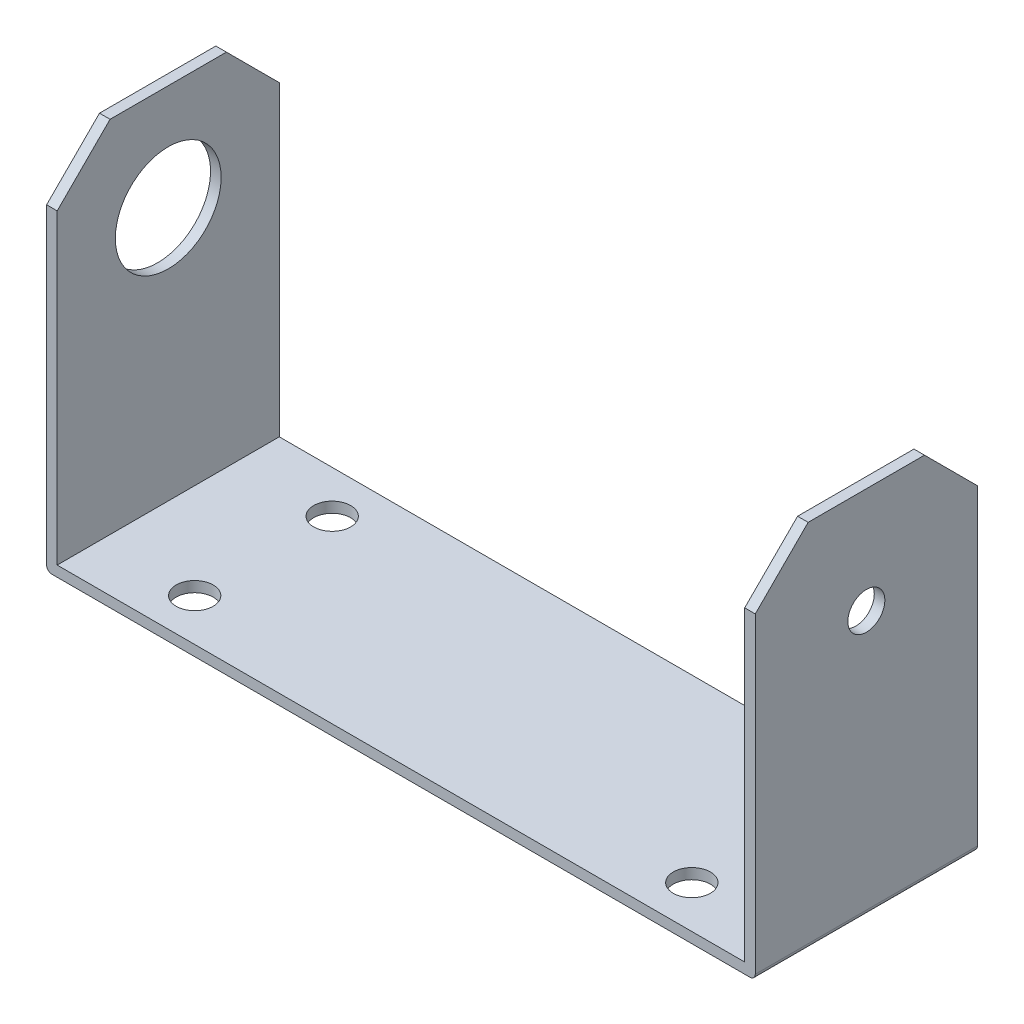
ISO-10303-21;
HEADER;
FILE_DESCRIPTION(('STEP AP214'),'2;1');
FILE_NAME('part.step','',(''),(''),'','','');
FILE_SCHEMA(('AUTOMOTIVE_DESIGN { 1 0 10303 214 1 1 1 1 }'));
ENDSEC;
DATA;
#1=APPLICATION_CONTEXT('core data for automotive mechanical design processes');
#2=APPLICATION_PROTOCOL_DEFINITION('international standard','automotive_design',2000,#1);
#3=PRODUCT_CONTEXT('',#1,'mechanical');
#4=PRODUCT('Part','Part','',(#3));
#5=PRODUCT_RELATED_PRODUCT_CATEGORY('part','',(#4));
#6=PRODUCT_DEFINITION_FORMATION('','',#4);
#7=PRODUCT_DEFINITION_CONTEXT('part definition',#1,'design');
#8=PRODUCT_DEFINITION('design','',#6,#7);
#9=PRODUCT_DEFINITION_SHAPE('','',#8);
#10=(LENGTH_UNIT() NAMED_UNIT(*) SI_UNIT(.MILLI.,.METRE.));
#11=(NAMED_UNIT(*) PLANE_ANGLE_UNIT() SI_UNIT($,.RADIAN.));
#12=(NAMED_UNIT(*) SI_UNIT($,.STERADIAN.) SOLID_ANGLE_UNIT());
#13=UNCERTAINTY_MEASURE_WITH_UNIT(LENGTH_MEASURE(1.E-05),#10,'distance_accuracy_value','');
#14=(GEOMETRIC_REPRESENTATION_CONTEXT(3) GLOBAL_UNCERTAINTY_ASSIGNED_CONTEXT((#13)) GLOBAL_UNIT_ASSIGNED_CONTEXT((#10,
#11,#12)) REPRESENTATION_CONTEXT('',''));
#15=CARTESIAN_POINT('',(0.,0.,0.));
#16=DIRECTION('',(0.,0.,1.));
#17=DIRECTION('',(1.,0.,0.));
#18=AXIS2_PLACEMENT_3D('',#15,#16,#17);
#19=CARTESIAN_POINT('',(0.,35.,0.));
#20=DIRECTION('',(0.,-1.,0.));
#21=DIRECTION('',(0.,0.,-1.));
#22=AXIS2_PLACEMENT_3D('',#19,#20,#21);
#23=PLANE('',#22);
#24=DIRECTION('',(0.,0.,-1.));
#25=VECTOR('',#24,1.);
#26=CARTESIAN_POINT('',(0.,35.,-21.));
#27=LINE('',#26,#25);
#28=CARTESIAN_POINT('',(0.,35.,-5.00000000000002));
#29=VERTEX_POINT('',#28);
#30=CARTESIAN_POINT('',(0.,35.,-16.));
#31=VERTEX_POINT('',#30);
#32=EDGE_CURVE('E179',#29,#31,#27,.T.);
#33=ORIENTED_EDGE('',*,*,#32,.T.);
#34=DIRECTION('',(-1.,0.,0.));
#35=VECTOR('',#34,1.);
#36=CARTESIAN_POINT('',(0.,35.,-16.));
#37=LINE('',#36,#35);
#38=CARTESIAN_POINT('',(-1.,35.,-16.));
#39=VERTEX_POINT('',#38);
#40=EDGE_CURVE('E220',#31,#39,#37,.T.);
#41=ORIENTED_EDGE('',*,*,#40,.T.);
#42=DIRECTION('',(0.,0.,-1.));
#43=VECTOR('',#42,1.);
#44=CARTESIAN_POINT('',(-1.,35.,0.));
#45=LINE('',#44,#43);
#46=CARTESIAN_POINT('',(-1.,35.,-5.00000000000002));
#47=VERTEX_POINT('',#46);
#48=EDGE_CURVE('E174',#47,#39,#45,.T.);
#49=ORIENTED_EDGE('',*,*,#48,.F.);
#50=DIRECTION('',(1.,0.,0.));
#51=VECTOR('',#50,1.);
#52=CARTESIAN_POINT('',(0.,35.,-5.00000000000002));
#53=LINE('',#52,#51);
#54=EDGE_CURVE('E217',#47,#29,#53,.T.);
#55=ORIENTED_EDGE('',*,*,#54,.T.);
#56=EDGE_LOOP('',(#33,#41,#49,#55));
#57=FACE_BOUND('',#56,.T.);
#58=ADVANCED_FACE('F35',(#57),#23,.F.);
#59=DIRECTION('',(0.,0.,1.));
#60=VECTOR('',#59,1.);
#61=CARTESIAN_POINT('',(-66.,35.,0.));
#62=LINE('',#61,#60);
#63=CARTESIAN_POINT('',(-66.,35.,-16.));
#64=VERTEX_POINT('',#63);
#65=CARTESIAN_POINT('',(-66.,35.,-5.00000000000002));
#66=VERTEX_POINT('',#65);
#67=EDGE_CURVE('E170',#64,#66,#62,.T.);
#68=ORIENTED_EDGE('',*,*,#67,.F.);
#69=DIRECTION('',(-1.,0.,0.));
#70=VECTOR('',#69,1.);
#71=CARTESIAN_POINT('',(0.,35.,-16.));
#72=LINE('',#71,#70);
#73=CARTESIAN_POINT('',(-67.,35.,-16.));
#74=VERTEX_POINT('',#73);
#75=EDGE_CURVE('E241',#64,#74,#72,.T.);
#76=ORIENTED_EDGE('',*,*,#75,.T.);
#77=DIRECTION('',(0.,0.,1.));
#78=VECTOR('',#77,1.);
#79=CARTESIAN_POINT('',(-67.,35.,0.));
#80=LINE('',#79,#78);
#81=CARTESIAN_POINT('',(-67.,35.,-5.00000000000002));
#82=VERTEX_POINT('',#81);
#83=EDGE_CURVE('E182',#74,#82,#80,.T.);
#84=ORIENTED_EDGE('',*,*,#83,.T.);
#85=DIRECTION('',(1.,0.,0.));
#86=VECTOR('',#85,1.);
#87=CARTESIAN_POINT('',(0.,35.,-5.00000000000002));
#88=LINE('',#87,#86);
#89=EDGE_CURVE('E238',#82,#66,#88,.T.);
#90=ORIENTED_EDGE('',*,*,#89,.T.);
#91=EDGE_LOOP('',(#68,#76,#84,#90));
#92=FACE_BOUND('',#91,.T.);
#93=ADVANCED_FACE('F255',(#92),#23,.F.);
#94=CARTESIAN_POINT('',(0.,35.,-21.));
#95=DIRECTION('',(-1.,0.,0.));
#96=DIRECTION('',(0.,0.,1.));
#97=AXIS2_PLACEMENT_3D('',#94,#95,#96);
#98=PLANE('',#97);
#99=CARTESIAN_POINT('',(0.,25.,-10.5));
#100=DIRECTION('',(1.,0.,0.));
#101=DIRECTION('',(0.,0.,-1.));
#102=AXIS2_PLACEMENT_3D('',#99,#100,#101);
#103=CIRCLE('',#102,1.75);
#104=CARTESIAN_POINT('',(0.,25.,-12.25));
#105=VERTEX_POINT('',#104);
#106=EDGE_CURVE('E457',#105,#105,#103,.T.);
#107=ORIENTED_EDGE('',*,*,#106,.F.);
#108=EDGE_LOOP('',(#107));
#109=FACE_BOUND('',#108,.T.);
#110=DIRECTION('',(0.,-1.,0.));
#111=VECTOR('',#110,1.);
#112=CARTESIAN_POINT('',(0.,35.,-21.));
#113=LINE('',#112,#111);
#114=CARTESIAN_POINT('',(0.,30.,-21.));
#115=VERTEX_POINT('',#114);
#116=CARTESIAN_POINT('',(0.,0.5,-21.));
#117=VERTEX_POINT('',#116);
#118=EDGE_CURVE('E195',#115,#117,#113,.T.);
#119=ORIENTED_EDGE('',*,*,#118,.F.);
#120=DIRECTION('',(0.,-0.707106781186548,-0.707106781186547));
#121=VECTOR('',#120,1.);
#122=CARTESIAN_POINT('',(0.,35.,-16.));
#123=LINE('',#122,#121);
#124=EDGE_CURVE('E232',#115,#31,#123,.F.);
#125=ORIENTED_EDGE('',*,*,#124,.T.);
#126=ORIENTED_EDGE('',*,*,#32,.F.);
#127=DIRECTION('',(0.,0.707106781186547,-0.707106781186548));
#128=VECTOR('',#127,1.);
#129=CARTESIAN_POINT('',(0.,35.,-5.00000000000002));
#130=LINE('',#129,#128);
#131=CARTESIAN_POINT('',(0.,30.,0.));
#132=VERTEX_POINT('',#131);
#133=EDGE_CURVE('E230',#29,#132,#130,.F.);
#134=ORIENTED_EDGE('',*,*,#133,.T.);
#135=DIRECTION('',(0.,-1.,0.));
#136=VECTOR('',#135,1.);
#137=CARTESIAN_POINT('',(0.,35.,0.));
#138=LINE('',#137,#136);
#139=CARTESIAN_POINT('',(0.,0.5,0.));
#140=VERTEX_POINT('',#139);
#141=EDGE_CURVE('E185',#132,#140,#138,.T.);
#142=ORIENTED_EDGE('',*,*,#141,.T.);
#143=DIRECTION('',(0.,0.,-1.));
#144=VECTOR('',#143,1.);
#145=CARTESIAN_POINT('',(0.,0.5,-21.));
#146=LINE('',#145,#144);
#147=EDGE_CURVE('E197',#140,#117,#146,.T.);
#148=ORIENTED_EDGE('',*,*,#147,.T.);
#149=EDGE_LOOP('',(#119,#125,#126,#134,#142,#148));
#150=FACE_BOUND('',#149,.T.);
#151=ADVANCED_FACE('F278',(#109,#150),#98,.F.);
#152=CARTESIAN_POINT('',(-67.,35.,-21.));
#153=DIRECTION('',(0.,0.,1.));
#154=DIRECTION('',(1.,0.,0.));
#155=AXIS2_PLACEMENT_3D('',#152,#153,#154);
#156=PLANE('',#155);
#157=DIRECTION('',(0.,-1.,0.));
#158=VECTOR('',#157,1.);
#159=CARTESIAN_POINT('',(-1.,35.,-21.));
#160=LINE('',#159,#158);
#161=CARTESIAN_POINT('',(-1.,30.,-21.));
#162=VERTEX_POINT('',#161);
#163=CARTESIAN_POINT('',(-1.,1.,-21.));
#164=VERTEX_POINT('',#163);
#165=EDGE_CURVE('E138',#162,#164,#160,.T.);
#166=ORIENTED_EDGE('',*,*,#165,.F.);
#167=DIRECTION('',(1.,0.,0.));
#168=VECTOR('',#167,1.);
#169=CARTESIAN_POINT('',(-67.,30.,-21.));
#170=LINE('',#169,#168);
#171=EDGE_CURVE('E228',#162,#115,#170,.T.);
#172=ORIENTED_EDGE('',*,*,#171,.T.);
#173=ORIENTED_EDGE('',*,*,#118,.T.);
#174=CARTESIAN_POINT('',(-0.5,0.5,-21.));
#175=DIRECTION('',(0.,0.,1.));
#176=DIRECTION('',(1.,0.,0.));
#177=AXIS2_PLACEMENT_3D('',#174,#175,#176);
#178=CIRCLE('',#177,0.5);
#179=CARTESIAN_POINT('',(-0.5,0.,-21.));
#180=VERTEX_POINT('',#179);
#181=EDGE_CURVE('E203',#117,#180,#178,.F.);
#182=ORIENTED_EDGE('',*,*,#181,.T.);
#183=DIRECTION('',(-1.,0.,0.));
#184=VECTOR('',#183,1.);
#185=CARTESIAN_POINT('',(-67.,0.,-21.));
#186=LINE('',#185,#184);
#187=CARTESIAN_POINT('',(-66.5,0.,-21.));
#188=VERTEX_POINT('',#187);
#189=EDGE_CURVE('E148',#180,#188,#186,.T.);
#190=ORIENTED_EDGE('',*,*,#189,.T.);
#191=CARTESIAN_POINT('',(-66.5,0.5,-21.));
#192=DIRECTION('',(0.,0.,1.));
#193=DIRECTION('',(1.,0.,0.));
#194=AXIS2_PLACEMENT_3D('',#191,#192,#193);
#195=CIRCLE('',#194,0.5);
#196=CARTESIAN_POINT('',(-67.,0.5,-21.));
#197=VERTEX_POINT('',#196);
#198=EDGE_CURVE('E200',#188,#197,#195,.F.);
#199=ORIENTED_EDGE('',*,*,#198,.T.);
#200=DIRECTION('',(0.,-1.,0.));
#201=VECTOR('',#200,1.);
#202=CARTESIAN_POINT('',(-67.,35.,-21.));
#203=LINE('',#202,#201);
#204=CARTESIAN_POINT('',(-67.,30.,-21.));
#205=VERTEX_POINT('',#204);
#206=EDGE_CURVE('E193',#205,#197,#203,.T.);
#207=ORIENTED_EDGE('',*,*,#206,.F.);
#208=DIRECTION('',(1.,0.,0.));
#209=VECTOR('',#208,1.);
#210=CARTESIAN_POINT('',(-67.,30.,-21.));
#211=LINE('',#210,#209);
#212=CARTESIAN_POINT('',(-66.,30.,-21.));
#213=VERTEX_POINT('',#212);
#214=EDGE_CURVE('E226',#205,#213,#211,.T.);
#215=ORIENTED_EDGE('',*,*,#214,.T.);
#216=DIRECTION('',(0.,-1.,0.));
#217=VECTOR('',#216,1.);
#218=CARTESIAN_POINT('',(-66.,35.,-21.));
#219=LINE('',#218,#217);
#220=CARTESIAN_POINT('',(-66.,1.,-21.));
#221=VERTEX_POINT('',#220);
#222=EDGE_CURVE('E149',#213,#221,#219,.T.);
#223=ORIENTED_EDGE('',*,*,#222,.T.);
#224=DIRECTION('',(-1.,0.,0.));
#225=VECTOR('',#224,1.);
#226=CARTESIAN_POINT('',(0.,1.,-21.));
#227=LINE('',#226,#225);
#228=EDGE_CURVE('E156',#164,#221,#227,.T.);
#229=ORIENTED_EDGE('',*,*,#228,.F.);
#230=EDGE_LOOP('',(#166,#172,#173,#182,#190,#199,#207,#215,#223,#229));
#231=FACE_BOUND('',#230,.T.);
#232=ADVANCED_FACE('F162',(#231),#156,.F.);
#233=CARTESIAN_POINT('',(-67.,35.,0.));
#234=DIRECTION('',(1.,0.,0.));
#235=DIRECTION('',(0.,0.,-1.));
#236=AXIS2_PLACEMENT_3D('',#233,#234,#235);
#237=PLANE('',#236);
#238=CARTESIAN_POINT('',(-67.,25.,-10.5));
#239=DIRECTION('',(-1.,0.,0.));
#240=DIRECTION('',(0.,0.,1.));
#241=AXIS2_PLACEMENT_3D('',#238,#239,#240);
#242=CIRCLE('',#241,4.99999999999999);
#243=CARTESIAN_POINT('',(-67.,25.,-5.50000000000001));
#244=VERTEX_POINT('',#243);
#245=EDGE_CURVE('E461',#244,#244,#242,.T.);
#246=ORIENTED_EDGE('',*,*,#245,.F.);
#247=EDGE_LOOP('',(#246));
#248=FACE_BOUND('',#247,.T.);
#249=ORIENTED_EDGE('',*,*,#83,.F.);
#250=DIRECTION('',(0.,0.707106781186548,0.707106781186547));
#251=VECTOR('',#250,1.);
#252=CARTESIAN_POINT('',(-67.,35.,-16.));
#253=LINE('',#252,#251);
#254=EDGE_CURVE('E58',#74,#205,#253,.F.);
#255=ORIENTED_EDGE('',*,*,#254,.T.);
#256=ORIENTED_EDGE('',*,*,#206,.T.);
#257=DIRECTION('',(0.,0.,1.));
#258=VECTOR('',#257,1.);
#259=CARTESIAN_POINT('',(-67.,0.5,0.));
#260=LINE('',#259,#258);
#261=CARTESIAN_POINT('',(-67.,0.5,0.));
#262=VERTEX_POINT('',#261);
#263=EDGE_CURVE('E214',#197,#262,#260,.T.);
#264=ORIENTED_EDGE('',*,*,#263,.T.);
#265=DIRECTION('',(0.,-1.,0.));
#266=VECTOR('',#265,1.);
#267=CARTESIAN_POINT('',(-67.,35.,0.));
#268=LINE('',#267,#266);
#269=CARTESIAN_POINT('',(-67.,30.,0.));
#270=VERTEX_POINT('',#269);
#271=EDGE_CURVE('E191',#270,#262,#268,.T.);
#272=ORIENTED_EDGE('',*,*,#271,.F.);
#273=DIRECTION('',(0.,-0.707106781186547,0.707106781186548));
#274=VECTOR('',#273,1.);
#275=CARTESIAN_POINT('',(-67.,35.,-5.00000000000002));
#276=LINE('',#275,#274);
#277=EDGE_CURVE('E50',#270,#82,#276,.F.);
#278=ORIENTED_EDGE('',*,*,#277,.T.);
#279=EDGE_LOOP('',(#249,#255,#256,#264,#272,#278));
#280=FACE_BOUND('',#279,.T.);
#281=ADVANCED_FACE('F256',(#248,#280),#237,.F.);
#282=CARTESIAN_POINT('',(0.,35.,0.));
#283=DIRECTION('',(0.,0.,-1.));
#284=DIRECTION('',(-1.,0.,0.));
#285=AXIS2_PLACEMENT_3D('',#282,#283,#284);
#286=PLANE('',#285);
#287=ORIENTED_EDGE('',*,*,#141,.F.);
#288=DIRECTION('',(-1.,0.,0.));
#289=VECTOR('',#288,1.);
#290=CARTESIAN_POINT('',(0.,30.,0.));
#291=LINE('',#290,#289);
#292=CARTESIAN_POINT('',(-1.,30.,0.));
#293=VERTEX_POINT('',#292);
#294=EDGE_CURVE('E236',#132,#293,#291,.T.);
#295=ORIENTED_EDGE('',*,*,#294,.T.);
#296=DIRECTION('',(0.,-1.,0.));
#297=VECTOR('',#296,1.);
#298=CARTESIAN_POINT('',(-1.,35.,0.));
#299=LINE('',#298,#297);
#300=CARTESIAN_POINT('',(-1.,1.,0.));
#301=VERTEX_POINT('',#300);
#302=EDGE_CURVE('E173',#293,#301,#299,.T.);
#303=ORIENTED_EDGE('',*,*,#302,.T.);
#304=DIRECTION('',(1.,0.,0.));
#305=VECTOR('',#304,1.);
#306=CARTESIAN_POINT('',(0.,1.,0.));
#307=LINE('',#306,#305);
#308=CARTESIAN_POINT('',(-66.,1.,0.));
#309=VERTEX_POINT('',#308);
#310=EDGE_CURVE('E159',#309,#301,#307,.T.);
#311=ORIENTED_EDGE('',*,*,#310,.F.);
#312=DIRECTION('',(0.,-1.,0.));
#313=VECTOR('',#312,1.);
#314=CARTESIAN_POINT('',(-66.,35.,0.));
#315=LINE('',#314,#313);
#316=CARTESIAN_POINT('',(-66.,30.,0.));
#317=VERTEX_POINT('',#316);
#318=EDGE_CURVE('E169',#317,#309,#315,.T.);
#319=ORIENTED_EDGE('',*,*,#318,.F.);
#320=DIRECTION('',(-1.,0.,0.));
#321=VECTOR('',#320,1.);
#322=CARTESIAN_POINT('',(0.,30.,0.));
#323=LINE('',#322,#321);
#324=EDGE_CURVE('E234',#317,#270,#323,.T.);
#325=ORIENTED_EDGE('',*,*,#324,.T.);
#326=ORIENTED_EDGE('',*,*,#271,.T.);
#327=CARTESIAN_POINT('',(-66.5,0.5,0.));
#328=DIRECTION('',(0.,0.,-1.));
#329=DIRECTION('',(-1.,0.,0.));
#330=AXIS2_PLACEMENT_3D('',#327,#328,#329);
#331=CIRCLE('',#330,0.5);
#332=CARTESIAN_POINT('',(-66.5,0.,0.));
#333=VERTEX_POINT('',#332);
#334=EDGE_CURVE('E209',#262,#333,#331,.F.);
#335=ORIENTED_EDGE('',*,*,#334,.T.);
#336=DIRECTION('',(1.,0.,0.));
#337=VECTOR('',#336,1.);
#338=CARTESIAN_POINT('',(0.,0.,0.));
#339=LINE('',#338,#337);
#340=CARTESIAN_POINT('',(-0.5,0.,0.));
#341=VERTEX_POINT('',#340);
#342=EDGE_CURVE('E183',#333,#341,#339,.T.);
#343=ORIENTED_EDGE('',*,*,#342,.T.);
#344=CARTESIAN_POINT('',(-0.5,0.5,0.));
#345=DIRECTION('',(0.,0.,-1.));
#346=DIRECTION('',(-1.,0.,0.));
#347=AXIS2_PLACEMENT_3D('',#344,#345,#346);
#348=CIRCLE('',#347,0.5);
#349=EDGE_CURVE('E211',#341,#140,#348,.F.);
#350=ORIENTED_EDGE('',*,*,#349,.T.);
#351=EDGE_LOOP('',(#287,#295,#303,#311,#319,#325,#326,#335,#343,#350));
#352=FACE_BOUND('',#351,.T.);
#353=ADVANCED_FACE('F253',(#352),#286,.F.);
#354=CARTESIAN_POINT('',(0.,0.,0.));
#355=DIRECTION('',(0.,-1.,0.));
#356=DIRECTION('',(0.,0.,-1.));
#357=AXIS2_PLACEMENT_3D('',#354,#355,#356);
#358=PLANE('',#357);
#359=CARTESIAN_POINT('',(-57.,0.,-17.));
#360=DIRECTION('',(0.,1.,0.));
#361=DIRECTION('',(0.,0.,1.));
#362=AXIS2_PLACEMENT_3D('',#359,#360,#361);
#363=CIRCLE('',#362,1.75);
#364=CARTESIAN_POINT('',(-57.,0.,-15.25));
#365=VERTEX_POINT('',#364);
#366=EDGE_CURVE('E473',#365,#365,#363,.T.);
#367=ORIENTED_EDGE('',*,*,#366,.T.);
#368=EDGE_LOOP('',(#367));
#369=FACE_BOUND('',#368,.T.);
#370=CARTESIAN_POINT('',(-10.,0.,-17.));
#371=DIRECTION('',(0.,1.,0.));
#372=DIRECTION('',(0.,0.,1.));
#373=AXIS2_PLACEMENT_3D('',#370,#371,#372);
#374=CIRCLE('',#373,1.75);
#375=CARTESIAN_POINT('',(-10.,0.,-15.25));
#376=VERTEX_POINT('',#375);
#377=EDGE_CURVE('E479',#376,#376,#374,.T.);
#378=ORIENTED_EDGE('',*,*,#377,.T.);
#379=EDGE_LOOP('',(#378));
#380=FACE_BOUND('',#379,.T.);
#381=CARTESIAN_POINT('',(-10.,0.,-4.));
#382=DIRECTION('',(0.,1.,0.));
#383=DIRECTION('',(0.,0.,1.));
#384=AXIS2_PLACEMENT_3D('',#381,#382,#383);
#385=CIRCLE('',#384,1.75);
#386=CARTESIAN_POINT('',(-10.,0.,-2.25));
#387=VERTEX_POINT('',#386);
#388=EDGE_CURVE('E485',#387,#387,#385,.T.);
#389=ORIENTED_EDGE('',*,*,#388,.T.);
#390=EDGE_LOOP('',(#389));
#391=FACE_BOUND('',#390,.T.);
#392=CARTESIAN_POINT('',(-57.,0.,-4.));
#393=DIRECTION('',(0.,1.,0.));
#394=DIRECTION('',(0.,0.,1.));
#395=AXIS2_PLACEMENT_3D('',#392,#393,#394);
#396=CIRCLE('',#395,1.75);
#397=CARTESIAN_POINT('',(-57.,0.,-2.25));
#398=VERTEX_POINT('',#397);
#399=EDGE_CURVE('E160',#398,#398,#396,.T.);
#400=ORIENTED_EDGE('',*,*,#399,.T.);
#401=EDGE_LOOP('',(#400));
#402=FACE_BOUND('',#401,.T.);
#403=ORIENTED_EDGE('',*,*,#189,.F.);
#404=DIRECTION('',(0.,0.,-1.));
#405=VECTOR('',#404,1.);
#406=CARTESIAN_POINT('',(-0.5,0.,0.));
#407=LINE('',#406,#405);
#408=EDGE_CURVE('E207',#180,#341,#407,.F.);
#409=ORIENTED_EDGE('',*,*,#408,.T.);
#410=ORIENTED_EDGE('',*,*,#342,.F.);
#411=DIRECTION('',(0.,0.,1.));
#412=VECTOR('',#411,1.);
#413=CARTESIAN_POINT('',(-66.5,0.,-21.));
#414=LINE('',#413,#412);
#415=EDGE_CURVE('E205',#333,#188,#414,.F.);
#416=ORIENTED_EDGE('',*,*,#415,.T.);
#417=EDGE_LOOP('',(#403,#409,#410,#416));
#418=FACE_BOUND('',#417,.T.);
#419=ADVANCED_FACE('F282',(#369,#380,#391,#402,#418),#358,.T.);
#420=CARTESIAN_POINT('',(-1.,35.,-21.));
#421=DIRECTION('',(-1.,0.,0.));
#422=DIRECTION('',(0.,0.,1.));
#423=AXIS2_PLACEMENT_3D('',#420,#421,#422);
#424=PLANE('',#423);
#425=CARTESIAN_POINT('',(-1.,25.,-10.5));
#426=DIRECTION('',(-1.,0.,0.));
#427=DIRECTION('',(0.,0.,1.));
#428=AXIS2_PLACEMENT_3D('',#425,#426,#427);
#429=CIRCLE('',#428,1.75);
#430=CARTESIAN_POINT('',(-1.,25.,-8.75));
#431=VERTEX_POINT('',#430);
#432=EDGE_CURVE('E460',#431,#431,#429,.T.);
#433=ORIENTED_EDGE('',*,*,#432,.F.);
#434=EDGE_LOOP('',(#433));
#435=FACE_BOUND('',#434,.T.);
#436=ORIENTED_EDGE('',*,*,#48,.T.);
#437=DIRECTION('',(0.,0.707106781186548,0.707106781186547));
#438=VECTOR('',#437,1.);
#439=CARTESIAN_POINT('',(-1.,32.5,-18.5));
#440=LINE('',#439,#438);
#441=EDGE_CURVE('E144',#39,#162,#440,.F.);
#442=ORIENTED_EDGE('',*,*,#441,.T.);
#443=ORIENTED_EDGE('',*,*,#165,.T.);
#444=DIRECTION('',(0.,0.,-1.));
#445=VECTOR('',#444,1.);
#446=CARTESIAN_POINT('',(-1.,1.,0.));
#447=LINE('',#446,#445);
#448=EDGE_CURVE('E143',#301,#164,#447,.T.);
#449=ORIENTED_EDGE('',*,*,#448,.F.);
#450=ORIENTED_EDGE('',*,*,#302,.F.);
#451=DIRECTION('',(0.,-0.707106781186547,0.707106781186548));
#452=VECTOR('',#451,1.);
#453=CARTESIAN_POINT('',(-1.,43.,-13.));
#454=LINE('',#453,#452);
#455=EDGE_CURVE('E223',#293,#47,#454,.F.);
#456=ORIENTED_EDGE('',*,*,#455,.T.);
#457=EDGE_LOOP('',(#436,#442,#443,#449,#450,#456));
#458=FACE_BOUND('',#457,.T.);
#459=ADVANCED_FACE('F141',(#435,#458),#424,.T.);
#460=CARTESIAN_POINT('',(-66.,35.,0.));
#461=DIRECTION('',(1.,0.,0.));
#462=DIRECTION('',(0.,0.,-1.));
#463=AXIS2_PLACEMENT_3D('',#460,#461,#462);
#464=PLANE('',#463);
#465=CARTESIAN_POINT('',(-66.,25.,-10.5));
#466=DIRECTION('',(1.,0.,0.));
#467=DIRECTION('',(0.,0.,-1.));
#468=AXIS2_PLACEMENT_3D('',#465,#466,#467);
#469=CIRCLE('',#468,5.);
#470=CARTESIAN_POINT('',(-66.,25.,-15.5));
#471=VERTEX_POINT('',#470);
#472=EDGE_CURVE('E464',#471,#471,#469,.T.);
#473=ORIENTED_EDGE('',*,*,#472,.F.);
#474=EDGE_LOOP('',(#473));
#475=FACE_BOUND('',#474,.T.);
#476=ORIENTED_EDGE('',*,*,#222,.F.);
#477=DIRECTION('',(0.,-0.707106781186548,-0.707106781186547));
#478=VECTOR('',#477,1.);
#479=CARTESIAN_POINT('',(-66.,43.,-8.));
#480=LINE('',#479,#478);
#481=EDGE_CURVE('E11',#213,#64,#480,.F.);
#482=ORIENTED_EDGE('',*,*,#481,.T.);
#483=ORIENTED_EDGE('',*,*,#67,.T.);
#484=DIRECTION('',(0.,0.707106781186547,-0.707106781186548));
#485=VECTOR('',#484,1.);
#486=CARTESIAN_POINT('',(-66.,32.5,-2.50000000000001));
#487=LINE('',#486,#485);
#488=EDGE_CURVE('E43',#66,#317,#487,.F.);
#489=ORIENTED_EDGE('',*,*,#488,.T.);
#490=ORIENTED_EDGE('',*,*,#318,.T.);
#491=DIRECTION('',(0.,0.,1.));
#492=VECTOR('',#491,1.);
#493=CARTESIAN_POINT('',(-66.,1.,0.));
#494=LINE('',#493,#492);
#495=EDGE_CURVE('E164',#221,#309,#494,.T.);
#496=ORIENTED_EDGE('',*,*,#495,.F.);
#497=EDGE_LOOP('',(#476,#482,#483,#489,#490,#496));
#498=FACE_BOUND('',#497,.T.);
#499=ADVANCED_FACE('F246',(#475,#498),#464,.T.);
#500=CARTESIAN_POINT('',(0.,1.,0.));
#501=DIRECTION('',(0.,-1.,0.));
#502=DIRECTION('',(0.,0.,-1.));
#503=AXIS2_PLACEMENT_3D('',#500,#501,#502);
#504=PLANE('',#503);
#505=CARTESIAN_POINT('',(-57.,1.,-17.));
#506=DIRECTION('',(0.,1.,0.));
#507=DIRECTION('',(0.,0.,1.));
#508=AXIS2_PLACEMENT_3D('',#505,#506,#507);
#509=CIRCLE('',#508,1.75);
#510=CARTESIAN_POINT('',(-57.,1.,-15.25));
#511=VERTEX_POINT('',#510);
#512=EDGE_CURVE('E470',#511,#511,#509,.T.);
#513=ORIENTED_EDGE('',*,*,#512,.F.);
#514=EDGE_LOOP('',(#513));
#515=FACE_BOUND('',#514,.T.);
#516=CARTESIAN_POINT('',(-10.,1.,-17.));
#517=DIRECTION('',(0.,1.,0.));
#518=DIRECTION('',(0.,0.,1.));
#519=AXIS2_PLACEMENT_3D('',#516,#517,#518);
#520=CIRCLE('',#519,1.75);
#521=CARTESIAN_POINT('',(-10.,1.,-15.25));
#522=VERTEX_POINT('',#521);
#523=EDGE_CURVE('E476',#522,#522,#520,.T.);
#524=ORIENTED_EDGE('',*,*,#523,.F.);
#525=EDGE_LOOP('',(#524));
#526=FACE_BOUND('',#525,.T.);
#527=CARTESIAN_POINT('',(-10.,1.,-4.));
#528=DIRECTION('',(0.,1.,0.));
#529=DIRECTION('',(0.,0.,1.));
#530=AXIS2_PLACEMENT_3D('',#527,#528,#529);
#531=CIRCLE('',#530,1.75);
#532=CARTESIAN_POINT('',(-10.,1.,-2.25));
#533=VERTEX_POINT('',#532);
#534=EDGE_CURVE('E482',#533,#533,#531,.T.);
#535=ORIENTED_EDGE('',*,*,#534,.F.);
#536=EDGE_LOOP('',(#535));
#537=FACE_BOUND('',#536,.T.);
#538=CARTESIAN_POINT('',(-57.,1.,-4.));
#539=DIRECTION('',(0.,1.,0.));
#540=DIRECTION('',(0.,0.,1.));
#541=AXIS2_PLACEMENT_3D('',#538,#539,#540);
#542=CIRCLE('',#541,1.75);
#543=CARTESIAN_POINT('',(-57.,1.,-2.25));
#544=VERTEX_POINT('',#543);
#545=EDGE_CURVE('E488',#544,#544,#542,.T.);
#546=ORIENTED_EDGE('',*,*,#545,.F.);
#547=EDGE_LOOP('',(#546));
#548=FACE_BOUND('',#547,.T.);
#549=ORIENTED_EDGE('',*,*,#448,.T.);
#550=ORIENTED_EDGE('',*,*,#228,.T.);
#551=ORIENTED_EDGE('',*,*,#495,.T.);
#552=ORIENTED_EDGE('',*,*,#310,.T.);
#553=EDGE_LOOP('',(#549,#550,#551,#552));
#554=FACE_BOUND('',#553,.T.);
#555=ADVANCED_FACE('F154',(#515,#526,#537,#548,#554),#504,.F.);
#556=CARTESIAN_POINT('',(-0.5,0.5,-21.));
#557=DIRECTION('',(0.,0.,1.));
#558=DIRECTION('',(1.,0.,0.));
#559=AXIS2_PLACEMENT_3D('',#556,#557,#558);
#560=CYLINDRICAL_SURFACE('',#559,0.5);
#561=ORIENTED_EDGE('',*,*,#349,.F.);
#562=ORIENTED_EDGE('',*,*,#408,.F.);
#563=ORIENTED_EDGE('',*,*,#181,.F.);
#564=ORIENTED_EDGE('',*,*,#147,.F.);
#565=EDGE_LOOP('',(#561,#562,#563,#564));
#566=FACE_BOUND('',#565,.T.);
#567=ADVANCED_FACE('F296',(#566),#560,.T.);
#568=CARTESIAN_POINT('',(-66.5,0.5,0.));
#569=DIRECTION('',(0.,0.,-1.));
#570=DIRECTION('',(-1.,0.,0.));
#571=AXIS2_PLACEMENT_3D('',#568,#569,#570);
#572=CYLINDRICAL_SURFACE('',#571,0.5);
#573=ORIENTED_EDGE('',*,*,#198,.F.);
#574=ORIENTED_EDGE('',*,*,#415,.F.);
#575=ORIENTED_EDGE('',*,*,#334,.F.);
#576=ORIENTED_EDGE('',*,*,#263,.F.);
#577=EDGE_LOOP('',(#573,#574,#575,#576));
#578=FACE_BOUND('',#577,.T.);
#579=ADVANCED_FACE('F299',(#578),#572,.T.);
#580=CARTESIAN_POINT('',(0.,35.,-16.));
#581=DIRECTION('',(0.,-0.707106781186547,0.707106781186548));
#582=DIRECTION('',(-1.,0.,0.));
#583=AXIS2_PLACEMENT_3D('',#580,#581,#582);
#584=PLANE('',#583);
#585=ORIENTED_EDGE('',*,*,#124,.F.);
#586=ORIENTED_EDGE('',*,*,#171,.F.);
#587=ORIENTED_EDGE('',*,*,#441,.F.);
#588=ORIENTED_EDGE('',*,*,#40,.F.);
#589=EDGE_LOOP('',(#585,#586,#587,#588));
#590=FACE_BOUND('',#589,.T.);
#591=ADVANCED_FACE('F269',(#590),#584,.F.);
#592=CARTESIAN_POINT('',(0.,35.,-5.00000000000002));
#593=DIRECTION('',(0.,-0.707106781186548,-0.707106781186547));
#594=DIRECTION('',(1.,0.,0.));
#595=AXIS2_PLACEMENT_3D('',#592,#593,#594);
#596=PLANE('',#595);
#597=ORIENTED_EDGE('',*,*,#455,.F.);
#598=ORIENTED_EDGE('',*,*,#294,.F.);
#599=ORIENTED_EDGE('',*,*,#133,.F.);
#600=ORIENTED_EDGE('',*,*,#54,.F.);
#601=EDGE_LOOP('',(#597,#598,#599,#600));
#602=FACE_BOUND('',#601,.T.);
#603=ADVANCED_FACE('F263',(#602),#596,.F.);
#604=CARTESIAN_POINT('',(0.,35.,-16.));
#605=DIRECTION('',(0.,-0.707106781186547,0.707106781186548));
#606=DIRECTION('',(-1.,0.,0.));
#607=AXIS2_PLACEMENT_3D('',#604,#605,#606);
#608=PLANE('',#607);
#609=ORIENTED_EDGE('',*,*,#481,.F.);
#610=ORIENTED_EDGE('',*,*,#214,.F.);
#611=ORIENTED_EDGE('',*,*,#254,.F.);
#612=ORIENTED_EDGE('',*,*,#75,.F.);
#613=EDGE_LOOP('',(#609,#610,#611,#612));
#614=FACE_BOUND('',#613,.T.);
#615=ADVANCED_FACE('F261',(#614),#608,.F.);
#616=CARTESIAN_POINT('',(0.,35.,-5.00000000000002));
#617=DIRECTION('',(0.,-0.707106781186548,-0.707106781186547));
#618=DIRECTION('',(1.,0.,0.));
#619=AXIS2_PLACEMENT_3D('',#616,#617,#618);
#620=PLANE('',#619);
#621=ORIENTED_EDGE('',*,*,#277,.F.);
#622=ORIENTED_EDGE('',*,*,#324,.F.);
#623=ORIENTED_EDGE('',*,*,#488,.F.);
#624=ORIENTED_EDGE('',*,*,#89,.F.);
#625=EDGE_LOOP('',(#621,#622,#623,#624));
#626=FACE_BOUND('',#625,.T.);
#627=ADVANCED_FACE('F37',(#626),#620,.F.);
#628=CARTESIAN_POINT('',(-57.,1.,-4.));
#629=DIRECTION('',(0.,1.,0.));
#630=DIRECTION('',(0.,0.,1.));
#631=AXIS2_PLACEMENT_3D('',#628,#629,#630);
#632=CYLINDRICAL_SURFACE('',#631,1.75);
#633=ORIENTED_EDGE('',*,*,#399,.F.);
#634=EDGE_LOOP('',(#633));
#635=FACE_BOUND('',#634,.T.);
#636=ORIENTED_EDGE('',*,*,#545,.T.);
#637=EDGE_LOOP('',(#636));
#638=FACE_BOUND('',#637,.T.);
#639=ADVANCED_FACE('F268',(#635,#638),#632,.F.);
#640=CARTESIAN_POINT('',(-10.,1.,-4.));
#641=DIRECTION('',(0.,1.,0.));
#642=DIRECTION('',(0.,0.,1.));
#643=AXIS2_PLACEMENT_3D('',#640,#641,#642);
#644=CYLINDRICAL_SURFACE('',#643,1.75);
#645=ORIENTED_EDGE('',*,*,#388,.F.);
#646=EDGE_LOOP('',(#645));
#647=FACE_BOUND('',#646,.T.);
#648=ORIENTED_EDGE('',*,*,#534,.T.);
#649=EDGE_LOOP('',(#648));
#650=FACE_BOUND('',#649,.T.);
#651=ADVANCED_FACE('F372',(#647,#650),#644,.F.);
#652=CARTESIAN_POINT('',(-10.,1.,-17.));
#653=DIRECTION('',(0.,1.,0.));
#654=DIRECTION('',(0.,0.,1.));
#655=AXIS2_PLACEMENT_3D('',#652,#653,#654);
#656=CYLINDRICAL_SURFACE('',#655,1.75);
#657=ORIENTED_EDGE('',*,*,#377,.F.);
#658=EDGE_LOOP('',(#657));
#659=FACE_BOUND('',#658,.T.);
#660=ORIENTED_EDGE('',*,*,#523,.T.);
#661=EDGE_LOOP('',(#660));
#662=FACE_BOUND('',#661,.T.);
#663=ADVANCED_FACE('F382',(#659,#662),#656,.F.);
#664=CARTESIAN_POINT('',(-57.,1.,-17.));
#665=DIRECTION('',(0.,1.,0.));
#666=DIRECTION('',(0.,0.,1.));
#667=AXIS2_PLACEMENT_3D('',#664,#665,#666);
#668=CYLINDRICAL_SURFACE('',#667,1.75);
#669=ORIENTED_EDGE('',*,*,#366,.F.);
#670=EDGE_LOOP('',(#669));
#671=FACE_BOUND('',#670,.T.);
#672=ORIENTED_EDGE('',*,*,#512,.T.);
#673=EDGE_LOOP('',(#672));
#674=FACE_BOUND('',#673,.T.);
#675=ADVANCED_FACE('F392',(#671,#674),#668,.F.);
#676=CARTESIAN_POINT('',(-67.,25.,-10.5));
#677=DIRECTION('',(-1.,0.,0.));
#678=DIRECTION('',(0.,0.,1.));
#679=AXIS2_PLACEMENT_3D('',#676,#677,#678);
#680=CYLINDRICAL_SURFACE('',#679,5.);
#681=ORIENTED_EDGE('',*,*,#245,.T.);
#682=EDGE_LOOP('',(#681));
#683=FACE_BOUND('',#682,.T.);
#684=ORIENTED_EDGE('',*,*,#472,.T.);
#685=EDGE_LOOP('',(#684));
#686=FACE_BOUND('',#685,.T.);
#687=ADVANCED_FACE('F402',(#683,#686),#680,.F.);
#688=CARTESIAN_POINT('',(0.,25.,-10.5));
#689=DIRECTION('',(1.,0.,0.));
#690=DIRECTION('',(0.,0.,-1.));
#691=AXIS2_PLACEMENT_3D('',#688,#689,#690);
#692=CYLINDRICAL_SURFACE('',#691,1.75);
#693=ORIENTED_EDGE('',*,*,#106,.T.);
#694=EDGE_LOOP('',(#693));
#695=FACE_BOUND('',#694,.T.);
#696=ORIENTED_EDGE('',*,*,#432,.T.);
#697=EDGE_LOOP('',(#696));
#698=FACE_BOUND('',#697,.T.);
#699=ADVANCED_FACE('F426',(#695,#698),#692,.F.);
#700=CLOSED_SHELL('',(#58,#93,#151,#232,#281,#353,#419,#459,#499,#555,#567,#579,#591,#603,#615,
#627,#639,#651,#663,#675,#687,#699));
#701=MANIFOLD_SOLID_BREP('B2',#700);
#702=ADVANCED_BREP_SHAPE_REPRESENTATION('',(#18,#701),#14);
#703=SHAPE_DEFINITION_REPRESENTATION(#9,#702);
ENDSEC;
END-ISO-10303-21;
